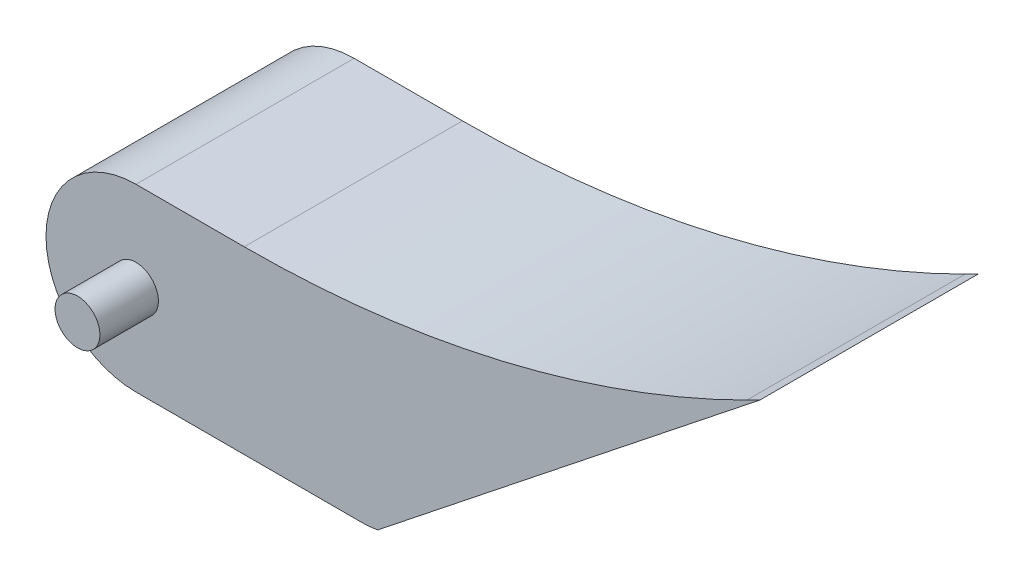
ISO-10303-21;
HEADER;
FILE_DESCRIPTION(('STEP AP214'),'2;1');
FILE_NAME('part.step','',(''),(''),'','','');
FILE_SCHEMA(('AUTOMOTIVE_DESIGN { 1 0 10303 214 1 1 1 1 }'));
ENDSEC;
DATA;
#1=APPLICATION_CONTEXT('core data for automotive mechanical design processes');
#2=APPLICATION_PROTOCOL_DEFINITION('international standard','automotive_design',2000,#1);
#3=PRODUCT_CONTEXT('',#1,'mechanical');
#4=PRODUCT('Part','Part','',(#3));
#5=PRODUCT_RELATED_PRODUCT_CATEGORY('part','',(#4));
#6=PRODUCT_DEFINITION_FORMATION('','',#4);
#7=PRODUCT_DEFINITION_CONTEXT('part definition',#1,'design');
#8=PRODUCT_DEFINITION('design','',#6,#7);
#9=PRODUCT_DEFINITION_SHAPE('','',#8);
#10=(LENGTH_UNIT() NAMED_UNIT(*) SI_UNIT(.MILLI.,.METRE.));
#11=(NAMED_UNIT(*) PLANE_ANGLE_UNIT() SI_UNIT($,.RADIAN.));
#12=(NAMED_UNIT(*) SI_UNIT($,.STERADIAN.) SOLID_ANGLE_UNIT());
#13=UNCERTAINTY_MEASURE_WITH_UNIT(LENGTH_MEASURE(1.E-05),#10,'distance_accuracy_value','');
#14=(GEOMETRIC_REPRESENTATION_CONTEXT(3) GLOBAL_UNCERTAINTY_ASSIGNED_CONTEXT((#13)) GLOBAL_UNIT_ASSIGNED_CONTEXT((#10,
#11,#12)) REPRESENTATION_CONTEXT('',''));
#15=CARTESIAN_POINT('',(0.,0.,0.));
#16=DIRECTION('',(0.,0.,1.));
#17=DIRECTION('',(1.,0.,0.));
#18=AXIS2_PLACEMENT_3D('',#15,#16,#17);
#19=CARTESIAN_POINT('',(100.180824207815,0.,97.));
#20=DIRECTION('',(0.,0.,-1.));
#21=DIRECTION('',(-1.,0.,0.));
#22=AXIS2_PLACEMENT_3D('',#19,#20,#21);
#23=CYLINDRICAL_SURFACE('',#22,40.);
#24=CARTESIAN_POINT('',(100.180824207815,0.,0.));
#25=DIRECTION('',(0.,0.,1.));
#26=DIRECTION('',(1.,0.,0.));
#27=AXIS2_PLACEMENT_3D('',#24,#25,#26);
#28=CIRCLE('',#27,40.);
#29=CARTESIAN_POINT('',(100.180824207815,-40.,0.));
#30=VERTEX_POINT('',#29);
#31=CARTESIAN_POINT('',(107.503389254849,-39.3240389727702,0.));
#32=VERTEX_POINT('',#31);
#33=EDGE_CURVE('E117',#30,#32,#28,.T.);
#34=ORIENTED_EDGE('',*,*,#33,.T.);
#35=DIRECTION('',(0.,0.,-1.));
#36=VECTOR('',#35,1.);
#37=CARTESIAN_POINT('',(107.503389254849,-39.3240389727702,97.));
#38=LINE('',#37,#36);
#39=CARTESIAN_POINT('',(107.503389254849,-39.3240389727702,97.));
#40=VERTEX_POINT('',#39);
#41=EDGE_CURVE('E99',#40,#32,#38,.T.);
#42=ORIENTED_EDGE('',*,*,#41,.F.);
#43=CARTESIAN_POINT('',(100.180824207815,0.,97.));
#44=DIRECTION('',(0.,0.,1.));
#45=DIRECTION('',(1.,0.,0.));
#46=AXIS2_PLACEMENT_3D('',#43,#44,#45);
#47=CIRCLE('',#46,40.);
#48=CARTESIAN_POINT('',(100.180824207815,-40.,97.));
#49=VERTEX_POINT('',#48);
#50=EDGE_CURVE('E105',#49,#40,#47,.T.);
#51=ORIENTED_EDGE('',*,*,#50,.F.);
#52=DIRECTION('',(0.,0.,-1.));
#53=VECTOR('',#52,1.);
#54=CARTESIAN_POINT('',(100.180824207815,-40.,97.));
#55=LINE('',#54,#53);
#56=EDGE_CURVE('E195',#49,#30,#55,.T.);
#57=ORIENTED_EDGE('',*,*,#56,.T.);
#58=EDGE_LOOP('',(#34,#42,#51,#57));
#59=FACE_BOUND('',#58,.T.);
#60=ADVANCED_FACE('F32',(#59),#23,.T.);
#61=CARTESIAN_POINT('',(277.355906925763,95.5881119443385,97.));
#62=DIRECTION('',(-0.621964891022489,0.783045129181826,0.));
#63=DIRECTION('',(-0.783045129181826,-0.621964891022489,0.));
#64=AXIS2_PLACEMENT_3D('',#61,#62,#63);
#65=PLANE('',#64);
#66=DIRECTION('',(0.783045129181826,0.621964891022489,0.));
#67=VECTOR('',#66,1.);
#68=CARTESIAN_POINT('',(277.355906925763,95.5881119443385,0.));
#69=LINE('',#68,#67);
#70=CARTESIAN_POINT('',(277.355906925763,95.5881119443385,0.));
#71=VERTEX_POINT('',#70);
#72=EDGE_CURVE('E197',#32,#71,#69,.T.);
#73=ORIENTED_EDGE('',*,*,#72,.T.);
#74=DIRECTION('',(0.,0.,-1.));
#75=VECTOR('',#74,1.);
#76=CARTESIAN_POINT('',(277.355906925763,95.5881119443385,97.));
#77=LINE('',#76,#75);
#78=CARTESIAN_POINT('',(277.355906925763,95.5881119443385,97.));
#79=VERTEX_POINT('',#78);
#80=EDGE_CURVE('E102',#79,#71,#77,.T.);
#81=ORIENTED_EDGE('',*,*,#80,.F.);
#82=DIRECTION('',(0.783045129181826,0.621964891022489,0.));
#83=VECTOR('',#82,1.);
#84=CARTESIAN_POINT('',(277.355906925763,95.5881119443385,97.));
#85=LINE('',#84,#83);
#86=EDGE_CURVE('E95',#40,#79,#85,.T.);
#87=ORIENTED_EDGE('',*,*,#86,.F.);
#88=ORIENTED_EDGE('',*,*,#41,.T.);
#89=EDGE_LOOP('',(#73,#81,#87,#88));
#90=FACE_BOUND('',#89,.T.);
#91=ADVANCED_FACE('F97',(#90),#65,.F.);
#92=CARTESIAN_POINT('',(132.685868324596,23.3114158078419,97.));
#93=DIRECTION('',(0.446925057845044,-0.894571401661267,0.));
#94=DIRECTION('',(0.894571401661267,0.446925057845044,0.));
#95=AXIS2_PLACEMENT_3D('',#92,#93,#94);
#96=PLANE('',#95);
#97=DIRECTION('',(-0.894571401661267,-0.446925057845044,0.));
#98=VECTOR('',#97,1.);
#99=CARTESIAN_POINT('',(132.685868324596,23.3114158078419,0.));
#100=LINE('',#99,#98);
#101=CARTESIAN_POINT('',(271.603643370404,92.7142991693664,0.));
#102=VERTEX_POINT('',#101);
#103=EDGE_CURVE('E199',#71,#102,#100,.T.);
#104=ORIENTED_EDGE('',*,*,#103,.T.);
#105=DIRECTION('',(0.,0.,-1.));
#106=VECTOR('',#105,1.);
#107=CARTESIAN_POINT('',(271.603643370404,92.7142991693664,97.));
#108=LINE('',#107,#106);
#109=CARTESIAN_POINT('',(271.603643370404,92.7142991693664,97.));
#110=VERTEX_POINT('',#109);
#111=EDGE_CURVE('E49',#102,#110,#108,.F.);
#112=ORIENTED_EDGE('',*,*,#111,.T.);
#113=DIRECTION('',(-0.894571401661267,-0.446925057845044,0.));
#114=VECTOR('',#113,1.);
#115=CARTESIAN_POINT('',(132.685868324596,23.3114158078419,97.));
#116=LINE('',#115,#114);
#117=EDGE_CURVE('E104',#79,#110,#116,.T.);
#118=ORIENTED_EDGE('',*,*,#117,.F.);
#119=ORIENTED_EDGE('',*,*,#80,.T.);
#120=EDGE_LOOP('',(#104,#112,#118,#119));
#121=FACE_BOUND('',#120,.T.);
#122=ADVANCED_FACE('F155',(#121),#96,.F.);
#123=CARTESIAN_POINT('',(0.,40.,97.));
#124=DIRECTION('',(0.,-1.,0.));
#125=DIRECTION('',(0.,0.,-1.));
#126=AXIS2_PLACEMENT_3D('',#123,#124,#125);
#127=PLANE('',#126);
#128=DIRECTION('',(-1.,0.,0.));
#129=VECTOR('',#128,1.);
#130=CARTESIAN_POINT('',(0.,40.,97.));
#131=LINE('',#130,#129);
#132=CARTESIAN_POINT('',(48.1411144478819,40.,97.));
#133=VERTEX_POINT('',#132);
#134=CARTESIAN_POINT('',(0.,40.,97.));
#135=VERTEX_POINT('',#134);
#136=EDGE_CURVE('E129',#133,#135,#131,.T.);
#137=ORIENTED_EDGE('',*,*,#136,.F.);
#138=DIRECTION('',(0.,0.,-1.));
#139=VECTOR('',#138,1.);
#140=CARTESIAN_POINT('',(48.1411144478819,40.,0.));
#141=LINE('',#140,#139);
#142=CARTESIAN_POINT('',(48.1411144478819,40.,0.));
#143=VERTEX_POINT('',#142);
#144=EDGE_CURVE('E118',#133,#143,#141,.T.);
#145=ORIENTED_EDGE('',*,*,#144,.T.);
#146=DIRECTION('',(-1.,0.,0.));
#147=VECTOR('',#146,1.);
#148=CARTESIAN_POINT('',(0.,40.,0.));
#149=LINE('',#148,#147);
#150=CARTESIAN_POINT('',(0.,40.,0.));
#151=VERTEX_POINT('',#150);
#152=EDGE_CURVE('E201',#143,#151,#149,.T.);
#153=ORIENTED_EDGE('',*,*,#152,.T.);
#154=DIRECTION('',(0.,0.,-1.));
#155=VECTOR('',#154,1.);
#156=CARTESIAN_POINT('',(0.,40.,97.));
#157=LINE('',#156,#155);
#158=EDGE_CURVE('E122',#135,#151,#157,.T.);
#159=ORIENTED_EDGE('',*,*,#158,.F.);
#160=EDGE_LOOP('',(#137,#145,#153,#159));
#161=FACE_BOUND('',#160,.T.);
#162=ADVANCED_FACE('F134',(#161),#127,.F.);
#163=CARTESIAN_POINT('',(0.,0.,97.));
#164=DIRECTION('',(0.,0.,-1.));
#165=DIRECTION('',(-1.,0.,0.));
#166=AXIS2_PLACEMENT_3D('',#163,#164,#165);
#167=CYLINDRICAL_SURFACE('',#166,40.);
#168=CARTESIAN_POINT('',(0.,0.,0.));
#169=DIRECTION('',(0.,0.,1.));
#170=DIRECTION('',(1.,0.,0.));
#171=AXIS2_PLACEMENT_3D('',#168,#169,#170);
#172=CIRCLE('',#171,40.);
#173=CARTESIAN_POINT('',(0.,-40.,0.));
#174=VERTEX_POINT('',#173);
#175=EDGE_CURVE('E203',#151,#174,#172,.T.);
#176=ORIENTED_EDGE('',*,*,#175,.T.);
#177=DIRECTION('',(0.,0.,-1.));
#178=VECTOR('',#177,1.);
#179=CARTESIAN_POINT('',(0.,-40.,97.));
#180=LINE('',#179,#178);
#181=CARTESIAN_POINT('',(0.,-40.,97.));
#182=VERTEX_POINT('',#181);
#183=EDGE_CURVE('E207',#182,#174,#180,.T.);
#184=ORIENTED_EDGE('',*,*,#183,.F.);
#185=CARTESIAN_POINT('',(0.,0.,97.));
#186=DIRECTION('',(0.,0.,1.));
#187=DIRECTION('',(1.,0.,0.));
#188=AXIS2_PLACEMENT_3D('',#185,#186,#187);
#189=CIRCLE('',#188,40.);
#190=EDGE_CURVE('E137',#135,#182,#189,.T.);
#191=ORIENTED_EDGE('',*,*,#190,.F.);
#192=ORIENTED_EDGE('',*,*,#158,.T.);
#193=EDGE_LOOP('',(#176,#184,#191,#192));
#194=FACE_BOUND('',#193,.T.);
#195=ADVANCED_FACE('F162',(#194),#167,.T.);
#196=CARTESIAN_POINT('',(0.,-40.,97.));
#197=DIRECTION('',(0.,1.,0.));
#198=DIRECTION('',(0.,0.,1.));
#199=AXIS2_PLACEMENT_3D('',#196,#197,#198);
#200=PLANE('',#199);
#201=DIRECTION('',(1.,0.,0.));
#202=VECTOR('',#201,1.);
#203=CARTESIAN_POINT('',(0.,-40.,0.));
#204=LINE('',#203,#202);
#205=EDGE_CURVE('E114',#174,#30,#204,.T.);
#206=ORIENTED_EDGE('',*,*,#205,.T.);
#207=ORIENTED_EDGE('',*,*,#56,.F.);
#208=DIRECTION('',(1.,0.,0.));
#209=VECTOR('',#208,1.);
#210=CARTESIAN_POINT('',(0.,-40.,97.));
#211=LINE('',#210,#209);
#212=EDGE_CURVE('E110',#182,#49,#211,.T.);
#213=ORIENTED_EDGE('',*,*,#212,.F.);
#214=ORIENTED_EDGE('',*,*,#183,.T.);
#215=EDGE_LOOP('',(#206,#207,#213,#214));
#216=FACE_BOUND('',#215,.T.);
#217=ADVANCED_FACE('F165',(#216),#200,.F.);
#218=CARTESIAN_POINT('',(100.180824207815,0.,97.));
#219=DIRECTION('',(0.,0.,1.));
#220=DIRECTION('',(1.,0.,0.));
#221=AXIS2_PLACEMENT_3D('',#218,#219,#220);
#222=PLANE('',#221);
#223=CARTESIAN_POINT('',(0.,0.,97.));
#224=DIRECTION('',(0.,0.,1.));
#225=DIRECTION('',(1.,0.,0.));
#226=AXIS2_PLACEMENT_3D('',#223,#224,#225);
#227=CIRCLE('',#226,9.966);
#228=CARTESIAN_POINT('',(9.966,0.,97.));
#229=VERTEX_POINT('',#228);
#230=EDGE_CURVE('E11',#229,#229,#227,.T.);
#231=ORIENTED_EDGE('',*,*,#230,.F.);
#232=EDGE_LOOP('',(#231));
#233=FACE_BOUND('',#232,.T.);
#234=ORIENTED_EDGE('',*,*,#50,.T.);
#235=ORIENTED_EDGE('',*,*,#86,.T.);
#236=ORIENTED_EDGE('',*,*,#117,.T.);
#237=CARTESIAN_POINT('',(48.1411144478819,540.,97.));
#238=DIRECTION('',(0.,0.,1.));
#239=DIRECTION('',(1.,0.,0.));
#240=AXIS2_PLACEMENT_3D('',#237,#238,#239);
#241=CIRCLE('',#240,500.);
#242=EDGE_CURVE('E41',#110,#133,#241,.F.);
#243=ORIENTED_EDGE('',*,*,#242,.T.);
#244=ORIENTED_EDGE('',*,*,#136,.T.);
#245=ORIENTED_EDGE('',*,*,#190,.T.);
#246=ORIENTED_EDGE('',*,*,#212,.T.);
#247=EDGE_LOOP('',(#234,#235,#236,#243,#244,#245,#246));
#248=FACE_BOUND('',#247,.T.);
#249=ADVANCED_FACE('F108',(#233,#248),#222,.T.);
#250=CARTESIAN_POINT('',(100.180824207815,0.,0.));
#251=DIRECTION('',(0.,0.,1.));
#252=DIRECTION('',(1.,0.,0.));
#253=AXIS2_PLACEMENT_3D('',#250,#251,#252);
#254=PLANE('',#253);
#255=CARTESIAN_POINT('',(0.,0.,0.));
#256=DIRECTION('',(0.,0.,1.));
#257=DIRECTION('',(1.,0.,0.));
#258=AXIS2_PLACEMENT_3D('',#255,#256,#257);
#259=CIRCLE('',#258,9.966);
#260=CARTESIAN_POINT('',(9.966,0.,0.));
#261=VERTEX_POINT('',#260);
#262=EDGE_CURVE('E36',#261,#261,#259,.T.);
#263=ORIENTED_EDGE('',*,*,#262,.T.);
#264=EDGE_LOOP('',(#263));
#265=FACE_BOUND('',#264,.T.);
#266=ORIENTED_EDGE('',*,*,#33,.F.);
#267=ORIENTED_EDGE('',*,*,#205,.F.);
#268=ORIENTED_EDGE('',*,*,#175,.F.);
#269=ORIENTED_EDGE('',*,*,#152,.F.);
#270=CARTESIAN_POINT('',(48.1411144478819,540.,0.));
#271=DIRECTION('',(0.,0.,1.));
#272=DIRECTION('',(1.,0.,0.));
#273=AXIS2_PLACEMENT_3D('',#270,#271,#272);
#274=CIRCLE('',#273,500.);
#275=EDGE_CURVE('E57',#143,#102,#274,.T.);
#276=ORIENTED_EDGE('',*,*,#275,.T.);
#277=ORIENTED_EDGE('',*,*,#103,.F.);
#278=ORIENTED_EDGE('',*,*,#72,.F.);
#279=EDGE_LOOP('',(#266,#267,#268,#269,#276,#277,#278));
#280=FACE_BOUND('',#279,.T.);
#281=ADVANCED_FACE('F141',(#265,#280),#254,.F.);
#282=CARTESIAN_POINT('',(48.1411144478819,540.,97.));
#283=DIRECTION('',(0.,0.,1.));
#284=DIRECTION('',(1.,0.,0.));
#285=AXIS2_PLACEMENT_3D('',#282,#283,#284);
#286=CYLINDRICAL_SURFACE('',#285,500.);
#287=ORIENTED_EDGE('',*,*,#242,.F.);
#288=ORIENTED_EDGE('',*,*,#111,.F.);
#289=ORIENTED_EDGE('',*,*,#275,.F.);
#290=ORIENTED_EDGE('',*,*,#144,.F.);
#291=EDGE_LOOP('',(#287,#288,#289,#290));
#292=FACE_BOUND('',#291,.T.);
#293=ADVANCED_FACE('F34',(#292),#286,.F.);
#294=CARTESIAN_POINT('',(0.,0.,-26.));
#295=DIRECTION('',(0.,0.,-1.));
#296=DIRECTION('',(-1.,0.,0.));
#297=AXIS2_PLACEMENT_3D('',#294,#295,#296);
#298=PLANE('',#297);
#299=CARTESIAN_POINT('',(0.,0.,-26.));
#300=DIRECTION('',(0.,0.,-1.));
#301=DIRECTION('',(-1.,0.,0.));
#302=AXIS2_PLACEMENT_3D('',#299,#300,#301);
#303=CIRCLE('',#302,9.966);
#304=CARTESIAN_POINT('',(-9.966,0.,-26.));
#305=VERTEX_POINT('',#304);
#306=EDGE_CURVE('E186',#305,#305,#303,.T.);
#307=ORIENTED_EDGE('',*,*,#306,.T.);
#308=EDGE_LOOP('',(#307));
#309=FACE_BOUND('',#308,.T.);
#310=ADVANCED_FACE('F140',(#309),#298,.T.);
#311=CARTESIAN_POINT('',(0.,0.,123.));
#312=DIRECTION('',(0.,0.,-1.));
#313=DIRECTION('',(-1.,0.,0.));
#314=AXIS2_PLACEMENT_3D('',#311,#312,#313);
#315=CYLINDRICAL_SURFACE('',#314,9.966);
#316=ORIENTED_EDGE('',*,*,#306,.F.);
#317=EDGE_LOOP('',(#316));
#318=FACE_BOUND('',#317,.T.);
#319=ORIENTED_EDGE('',*,*,#262,.F.);
#320=EDGE_LOOP('',(#319));
#321=FACE_BOUND('',#320,.T.);
#322=ADVANCED_FACE('F146',(#318,#321),#315,.T.);
#323=ORIENTED_EDGE('',*,*,#230,.T.);
#324=EDGE_LOOP('',(#323));
#325=FACE_BOUND('',#324,.T.);
#326=CARTESIAN_POINT('',(0.,0.,123.));
#327=DIRECTION('',(0.,0.,-1.));
#328=DIRECTION('',(-1.,0.,0.));
#329=AXIS2_PLACEMENT_3D('',#326,#327,#328);
#330=CIRCLE('',#329,9.966);
#331=CARTESIAN_POINT('',(-9.966,0.,123.));
#332=VERTEX_POINT('',#331);
#333=EDGE_CURVE('E184',#332,#332,#330,.T.);
#334=ORIENTED_EDGE('',*,*,#333,.T.);
#335=EDGE_LOOP('',(#334));
#336=FACE_BOUND('',#335,.T.);
#337=ADVANCED_FACE('F173',(#325,#336),#315,.T.);
#338=CARTESIAN_POINT('',(0.,0.,123.));
#339=DIRECTION('',(0.,0.,-1.));
#340=DIRECTION('',(-1.,0.,0.));
#341=AXIS2_PLACEMENT_3D('',#338,#339,#340);
#342=PLANE('',#341);
#343=ORIENTED_EDGE('',*,*,#333,.F.);
#344=EDGE_LOOP('',(#343));
#345=FACE_BOUND('',#344,.T.);
#346=ADVANCED_FACE('F176',(#345),#342,.F.);
#347=CLOSED_SHELL('',(#60,#91,#122,#162,#195,#217,#249,#281,#293,#310,#322,#337,#346));
#348=MANIFOLD_SOLID_BREP('B2',#347);
#349=ADVANCED_BREP_SHAPE_REPRESENTATION('',(#18,#348),#14);
#350=SHAPE_DEFINITION_REPRESENTATION(#9,#349);
ENDSEC;
END-ISO-10303-21;
